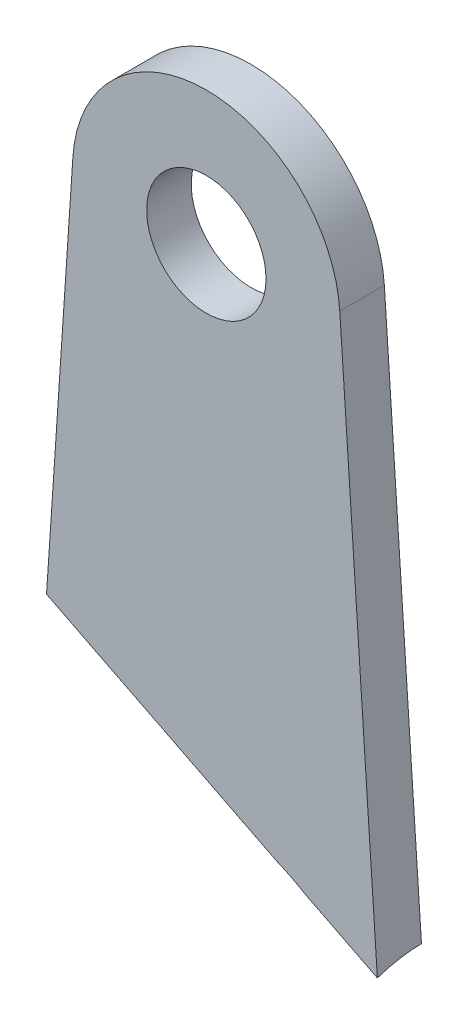
ISO-10303-21;
HEADER;
FILE_DESCRIPTION(('STEP AP214'),'2;1');
FILE_NAME('part.step','',(''),(''),'','','');
FILE_SCHEMA(('AUTOMOTIVE_DESIGN { 1 0 10303 214 1 1 1 1 }'));
ENDSEC;
DATA;
#1=APPLICATION_CONTEXT('core data for automotive mechanical design processes');
#2=APPLICATION_PROTOCOL_DEFINITION('international standard','automotive_design',2000,#1);
#3=PRODUCT_CONTEXT('',#1,'mechanical');
#4=PRODUCT('Part','Part','',(#3));
#5=PRODUCT_RELATED_PRODUCT_CATEGORY('part','',(#4));
#6=PRODUCT_DEFINITION_FORMATION('','',#4);
#7=PRODUCT_DEFINITION_CONTEXT('part definition',#1,'design');
#8=PRODUCT_DEFINITION('design','',#6,#7);
#9=PRODUCT_DEFINITION_SHAPE('','',#8);
#10=(LENGTH_UNIT() NAMED_UNIT(*) SI_UNIT(.MILLI.,.METRE.));
#11=(NAMED_UNIT(*) PLANE_ANGLE_UNIT() SI_UNIT($,.RADIAN.));
#12=(NAMED_UNIT(*) SI_UNIT($,.STERADIAN.) SOLID_ANGLE_UNIT());
#13=UNCERTAINTY_MEASURE_WITH_UNIT(LENGTH_MEASURE(1.E-05),#10,'distance_accuracy_value','');
#14=(GEOMETRIC_REPRESENTATION_CONTEXT(3) GLOBAL_UNCERTAINTY_ASSIGNED_CONTEXT((#13)) GLOBAL_UNIT_ASSIGNED_CONTEXT((#10,
#11,#12)) REPRESENTATION_CONTEXT('',''));
#15=CARTESIAN_POINT('',(0.,0.,0.));
#16=DIRECTION('',(0.,0.,1.));
#17=DIRECTION('',(1.,0.,0.));
#18=AXIS2_PLACEMENT_3D('',#15,#16,#17);
#19=CARTESIAN_POINT('',(-15.0779407829953,1.01470994331529,3.175));
#20=DIRECTION('',(-0.997743176257114,0.0671457685365675,0.));
#21=DIRECTION('',(-0.0671457685365675,-0.997743176257114,0.));
#22=AXIS2_PLACEMENT_3D('',#19,#20,#21);
#23=PLANE('',#22);
#24=DIRECTION('',(0.0671457685365675,0.997743176257114,0.));
#25=VECTOR('',#24,1.);
#26=CARTESIAN_POINT('',(-15.0779407829953,1.01470994331529,0.));
#27=LINE('',#26,#25);
#28=CARTESIAN_POINT('',(-17.0284415542147,-27.9684840417026,0.));
#29=VERTEX_POINT('',#28);
#30=CARTESIAN_POINT('',(-15.1703085430783,-0.357815896176073,0.));
#31=VERTEX_POINT('',#30);
#32=EDGE_CURVE('E137',#29,#31,#27,.T.);
#33=ORIENTED_EDGE('',*,*,#32,.F.);
#34=CARTESIAN_POINT('',(-17.9512657335414,-41.6810611388993,0.376993820158287));
#35=DIRECTION('',(-0.997743176257114,0.0671457685365675,0.));
#36=DIRECTION('',(-0.067007255340491,-0.995684958751841,-0.0641988368047146));
#37=AXIS2_PLACEMENT_3D('',#34,#35,#36);
#38=ELLIPSE('',#37,13.7587645560843,12.7);
#39=CARTESIAN_POINT('',(-17.0483398332545,-28.2641597419565,3.175));
#40=VERTEX_POINT('',#39);
#41=EDGE_CURVE('E228',#29,#40,#38,.F.);
#42=ORIENTED_EDGE('',*,*,#41,.T.);
#43=DIRECTION('',(0.0671457685365675,0.997743176257114,0.));
#44=VECTOR('',#43,1.);
#45=CARTESIAN_POINT('',(-15.0779407829953,1.01470994331529,3.175));
#46=LINE('',#45,#44);
#47=CARTESIAN_POINT('',(-15.1703085430783,-0.357815896176073,3.175));
#48=VERTEX_POINT('',#47);
#49=EDGE_CURVE('E215',#40,#48,#46,.T.);
#50=ORIENTED_EDGE('',*,*,#49,.T.);
#51=DIRECTION('',(0.,0.,-1.));
#52=VECTOR('',#51,1.);
#53=CARTESIAN_POINT('',(-15.1703085430783,-0.357815896176073,3.175));
#54=LINE('',#53,#52);
#55=EDGE_CURVE('E212',#48,#31,#54,.T.);
#56=ORIENTED_EDGE('',*,*,#55,.T.);
#57=EDGE_LOOP('',(#33,#42,#50,#56));
#58=FACE_BOUND('',#57,.T.);
#59=ADVANCED_FACE('F134',(#58),#23,.T.);
#60=CARTESIAN_POINT('',(3.79542939796974,0.255423469603652,3.175));
#61=DIRECTION('',(-0.997743176257114,-0.0671457685365677,0.));
#62=DIRECTION('',(0.0671457685365677,-0.997743176257114,0.));
#63=AXIS2_PLACEMENT_3D('',#60,#61,#62);
#64=PLANE('',#63);
#65=CARTESIAN_POINT('',(7.46803555554509,-54.3171551554375,-0.324270069861657));
#66=DIRECTION('',(-0.997743176257114,-0.0671457685365677,0.));
#67=DIRECTION('',(0.0670653370796551,-0.996548016248673,-0.0489315018492889));
#68=AXIS2_PLACEMENT_3D('',#65,#66,#67);
#69=ELLIPSE('',#68,14.7112011348926,12.7);
#70=CARTESIAN_POINT('',(6.4806028188548,-39.6445362172975,0.));
#71=VERTEX_POINT('',#70);
#72=CARTESIAN_POINT('',(6.51491125056596,-40.1543375699954,3.175));
#73=VERTEX_POINT('',#72);
#74=EDGE_CURVE('E12',#71,#73,#69,.F.);
#75=ORIENTED_EDGE('',*,*,#74,.F.);
#76=DIRECTION('',(-0.0671457685365677,0.997743176257114,0.));
#77=VECTOR('',#76,1.);
#78=CARTESIAN_POINT('',(3.79542939796974,0.255423469603652,0.));
#79=LINE('',#78,#77);
#80=CARTESIAN_POINT('',(3.83669896461977,-0.357815896176071,0.));
#81=VERTEX_POINT('',#80);
#82=EDGE_CURVE('E203',#71,#81,#79,.T.);
#83=ORIENTED_EDGE('',*,*,#82,.T.);
#84=DIRECTION('',(0.,0.,-1.));
#85=VECTOR('',#84,1.);
#86=CARTESIAN_POINT('',(3.83669896461977,-0.357815896176071,3.175));
#87=LINE('',#86,#85);
#88=CARTESIAN_POINT('',(3.83669896461977,-0.357815896176071,3.175));
#89=VERTEX_POINT('',#88);
#90=EDGE_CURVE('E207',#89,#81,#87,.T.);
#91=ORIENTED_EDGE('',*,*,#90,.F.);
#92=DIRECTION('',(-0.0671457685365677,0.997743176257114,0.));
#93=VECTOR('',#92,1.);
#94=CARTESIAN_POINT('',(3.79542939796974,0.255423469603652,3.175));
#95=LINE('',#94,#93);
#96=EDGE_CURVE('E227',#73,#89,#95,.T.);
#97=ORIENTED_EDGE('',*,*,#96,.F.);
#98=EDGE_LOOP('',(#75,#83,#91,#97));
#99=FACE_BOUND('',#98,.T.);
#100=ADVANCED_FACE('F236',(#99),#64,.F.);
#101=CARTESIAN_POINT('',(-5.66680478922925,-0.99737934148688,3.175));
#102=DIRECTION('',(0.,0.,-1.));
#103=DIRECTION('',(-1.,0.,0.));
#104=AXIS2_PLACEMENT_3D('',#101,#102,#103);
#105=CYLINDRICAL_SURFACE('',#104,9.52500000000001);
#106=CARTESIAN_POINT('',(-5.66680478922925,-0.99737934148688,0.));
#107=DIRECTION('',(0.,0.,1.));
#108=DIRECTION('',(1.,0.,0.));
#109=AXIS2_PLACEMENT_3D('',#106,#107,#108);
#110=CIRCLE('',#109,9.52500000000001);
#111=EDGE_CURVE('E211',#81,#31,#110,.T.);
#112=ORIENTED_EDGE('',*,*,#111,.T.);
#113=ORIENTED_EDGE('',*,*,#55,.F.);
#114=CARTESIAN_POINT('',(-5.66680478922925,-0.99737934148688,3.175));
#115=DIRECTION('',(0.,0.,1.));
#116=DIRECTION('',(1.,0.,0.));
#117=AXIS2_PLACEMENT_3D('',#114,#115,#116);
#118=CIRCLE('',#117,9.52500000000001);
#119=EDGE_CURVE('E224',#89,#48,#118,.T.);
#120=ORIENTED_EDGE('',*,*,#119,.F.);
#121=ORIENTED_EDGE('',*,*,#90,.T.);
#122=EDGE_LOOP('',(#112,#113,#120,#121));
#123=FACE_BOUND('',#122,.T.);
#124=ADVANCED_FACE('F240',(#123),#105,.T.);
#125=CARTESIAN_POINT('',(-5.66680478922925,-0.99737934148688,3.175));
#126=DIRECTION('',(0.,0.,-1.));
#127=DIRECTION('',(-1.,0.,0.));
#128=AXIS2_PLACEMENT_3D('',#125,#126,#127);
#129=CYLINDRICAL_SURFACE('',#128,4.25);
#130=CARTESIAN_POINT('',(-5.66680478922925,-0.99737934148688,3.175));
#131=DIRECTION('',(0.,0.,1.));
#132=DIRECTION('',(1.,0.,0.));
#133=AXIS2_PLACEMENT_3D('',#130,#131,#132);
#134=CIRCLE('',#133,4.25);
#135=CARTESIAN_POINT('',(-1.41680478922924,-0.99737934148688,3.175));
#136=VERTEX_POINT('',#135);
#137=EDGE_CURVE('E210',#136,#136,#134,.T.);
#138=ORIENTED_EDGE('',*,*,#137,.T.);
#139=EDGE_LOOP('',(#138));
#140=FACE_BOUND('',#139,.T.);
#141=CARTESIAN_POINT('',(-5.66680478922925,-0.99737934148688,0.));
#142=DIRECTION('',(0.,0.,1.));
#143=DIRECTION('',(1.,0.,0.));
#144=AXIS2_PLACEMENT_3D('',#141,#142,#143);
#145=CIRCLE('',#144,4.25);
#146=CARTESIAN_POINT('',(-1.41680478922924,-0.99737934148688,0.));
#147=VERTEX_POINT('',#146);
#148=EDGE_CURVE('E216',#147,#147,#145,.T.);
#149=ORIENTED_EDGE('',*,*,#148,.F.);
#150=EDGE_LOOP('',(#149));
#151=FACE_BOUND('',#150,.T.);
#152=ADVANCED_FACE('F267',(#140,#151),#129,.F.);
#153=CARTESIAN_POINT('',(0.,0.,3.175));
#154=DIRECTION('',(0.,0.,1.));
#155=DIRECTION('',(1.,0.,0.));
#156=AXIS2_PLACEMENT_3D('',#153,#154,#155);
#157=PLANE('',#156);
#158=CARTESIAN_POINT('',(-119.37294608286,8.73629194387435,3.175));
#159=DIRECTION('',(0.,0.,1.));
#160=DIRECTION('',(0.895461278499533,-0.445139414911757,0.));
#161=AXIS2_PLACEMENT_3D('',#158,#159,#160);
#162=ELLIPSE('',#161,514.246710902717,12.7);
#163=CARTESIAN_POINT('',(-0.678326929961488,-36.5202382657665,3.17500000000024));
#164=VERTEX_POINT('',#163);
#165=EDGE_CURVE('E223',#40,#164,#162,.F.);
#166=ORIENTED_EDGE('',*,*,#165,.T.);
#167=CARTESIAN_POINT('',(-7.89245378230938,-47.8710935338652,3.17500000000001));
#168=DIRECTION('',(0.,0.,1.));
#169=DIRECTION('',(-0.999030309085766,-0.044027735894535,0.));
#170=AXIS2_PLACEMENT_3D('',#167,#168,#169);
#171=ELLIPSE('',#170,15.5145140746698,12.7);
#172=CARTESIAN_POINT('',(1.45277880224457,-37.5964930663584,3.17500000000028));
#173=VERTEX_POINT('',#172);
#174=EDGE_CURVE('E193',#164,#173,#171,.F.);
#175=ORIENTED_EDGE('',*,*,#174,.T.);
#176=EDGE_CURVE('E196',#173,#73,#162,.F.);
#177=ORIENTED_EDGE('',*,*,#176,.T.);
#178=ORIENTED_EDGE('',*,*,#96,.T.);
#179=ORIENTED_EDGE('',*,*,#119,.T.);
#180=ORIENTED_EDGE('',*,*,#49,.F.);
#181=EDGE_LOOP('',(#166,#175,#177,#178,#179,#180));
#182=FACE_BOUND('',#181,.T.);
#183=ORIENTED_EDGE('',*,*,#137,.F.);
#184=EDGE_LOOP('',(#183));
#185=FACE_BOUND('',#184,.T.);
#186=ADVANCED_FACE('F247',(#182,#185),#157,.T.);
#187=CARTESIAN_POINT('',(0.,0.,0.));
#188=DIRECTION('',(0.,0.,1.));
#189=DIRECTION('',(1.,0.,0.));
#190=AXIS2_PLACEMENT_3D('',#187,#188,#189);
#191=PLANE('',#190);
#192=CARTESIAN_POINT('',(-5.66680478922768,-47.7730081352841,0.));
#193=DIRECTION('',(0.,0.,1.));
#194=DIRECTION('',(-0.999030309085766,-0.044027735894535,0.));
#195=AXIS2_PLACEMENT_3D('',#192,#193,#194);
#196=ELLIPSE('',#195,15.5145140746698,12.7);
#197=CARTESIAN_POINT('',(-2.16545721173594,-35.3460683496946,0.));
#198=VERTEX_POINT('',#197);
#199=CARTESIAN_POINT('',(6.3755517407407,-39.5922790998447,2.09034178855205E-13));
#200=VERTEX_POINT('',#199);
#201=EDGE_CURVE('E182',#198,#200,#196,.F.);
#202=ORIENTED_EDGE('',*,*,#201,.F.);
#203=CARTESIAN_POINT('',(-4.28605405630153,-48.4741235266383,0.));
#204=DIRECTION('',(0.,0.,1.));
#205=DIRECTION('',(0.895461278499533,-0.445139414911757,0.));
#206=AXIS2_PLACEMENT_3D('',#203,#204,#205);
#207=ELLIPSE('',#206,514.246710902717,12.7);
#208=EDGE_CURVE('E197',#29,#198,#207,.F.);
#209=ORIENTED_EDGE('',*,*,#208,.F.);
#210=ORIENTED_EDGE('',*,*,#32,.T.);
#211=ORIENTED_EDGE('',*,*,#111,.F.);
#212=ORIENTED_EDGE('',*,*,#82,.F.);
#213=EDGE_CURVE('E143',#200,#71,#207,.F.);
#214=ORIENTED_EDGE('',*,*,#213,.F.);
#215=EDGE_LOOP('',(#202,#209,#210,#211,#212,#214));
#216=FACE_BOUND('',#215,.T.);
#217=ORIENTED_EDGE('',*,*,#148,.T.);
#218=EDGE_LOOP('',(#217));
#219=FACE_BOUND('',#218,.T.);
#220=ADVANCED_FACE('F200',(#216,#219),#191,.F.);
#221=CARTESIAN_POINT('',(-180.853012296052,39.298418257961,4.87110289051718));
#222=DIRECTION('',(0.895188162308578,-0.445003647141152,-0.0246963174109684));
#223=DIRECTION('',(-0.427674491746879,-0.84209202662897,-0.328596329554917));
#224=AXIS2_PLACEMENT_3D('',#221,#222,#223);
#225=CYLINDRICAL_SURFACE('',#224,12.7);
#226=ORIENTED_EDGE('',*,*,#41,.F.);
#227=ORIENTED_EDGE('',*,*,#208,.T.);
#228=CARTESIAN_POINT('',(-5.6940335029641,-47.774208117513,0.0388431268281142));
#229=DIRECTION('',(-0.84180460506875,0.240514048221816,0.483237001369928));
#230=DIRECTION('',(0.328897885574344,-0.481316926976894,0.812502428716521));
#231=AXIS2_PLACEMENT_3D('',#228,#229,#230);
#232=ELLIPSE('',#231,14.5552513368896,12.7);
#233=EDGE_CURVE('E188',#164,#198,#232,.T.);
#234=ORIENTED_EDGE('',*,*,#233,.F.);
#235=ORIENTED_EDGE('',*,*,#165,.F.);
#236=EDGE_LOOP('',(#226,#227,#234,#235));
#237=FACE_BOUND('',#236,.T.);
#238=ADVANCED_FACE('F250',(#237),#225,.F.);
#239=CARTESIAN_POINT('',(-5.6940335029641,-47.774208117513,0.0388431268281142));
#240=DIRECTION('',(0.328897885574344,-0.481316926976894,0.812502428716521));
#241=DIRECTION('',(-0.84180460506875,0.240514048221816,0.483237001369928));
#242=AXIS2_PLACEMENT_3D('',#239,#240,#241);
#243=ELLIPSE('',#242,25.9954271389608,12.7);
#244=EDGE_CURVE('E185',#200,#173,#243,.T.);
#245=ORIENTED_EDGE('',*,*,#244,.F.);
#246=ORIENTED_EDGE('',*,*,#213,.T.);
#247=ORIENTED_EDGE('',*,*,#74,.T.);
#248=ORIENTED_EDGE('',*,*,#176,.F.);
#249=EDGE_LOOP('',(#245,#246,#247,#248));
#250=FACE_BOUND('',#249,.T.);
#251=ADVANCED_FACE('F195',(#250),#225,.F.);
#252=CARTESIAN_POINT('',(148.169426682981,-40.9933730144366,-219.455105653459));
#253=DIRECTION('',(-0.573823706593681,-0.0252886808079422,0.81858831922651));
#254=DIRECTION('',(-0.723643773798371,0.483689011447577,-0.492325734496703));
#255=AXIS2_PLACEMENT_3D('',#252,#253,#254);
#256=CYLINDRICAL_SURFACE('',#255,12.7);
#257=ORIENTED_EDGE('',*,*,#233,.T.);
#258=ORIENTED_EDGE('',*,*,#201,.T.);
#259=ORIENTED_EDGE('',*,*,#244,.T.);
#260=ORIENTED_EDGE('',*,*,#174,.F.);
#261=EDGE_LOOP('',(#257,#258,#259,#260));
#262=FACE_BOUND('',#261,.T.);
#263=ADVANCED_FACE('F184',(#262),#256,.F.);
#264=CLOSED_SHELL('',(#59,#100,#124,#152,#186,#220,#238,#251,#263));
#265=MANIFOLD_SOLID_BREP('B2',#264);
#266=ADVANCED_BREP_SHAPE_REPRESENTATION('',(#18,#265),#14);
#267=SHAPE_DEFINITION_REPRESENTATION(#9,#266);
ENDSEC;
END-ISO-10303-21;
